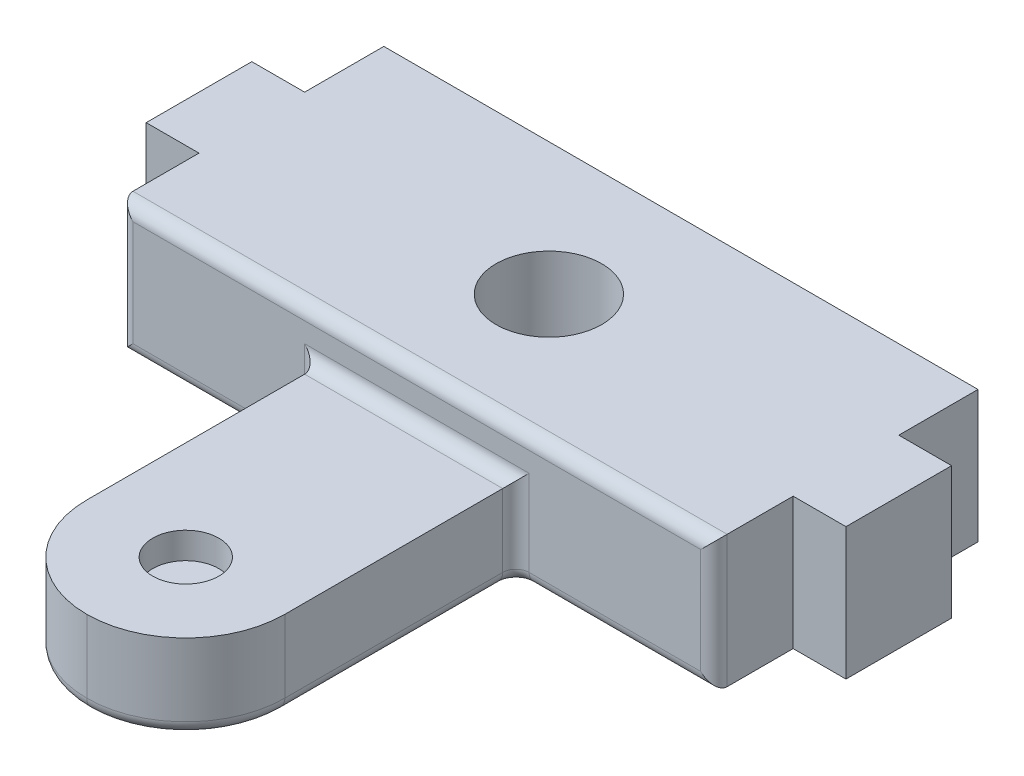
ISO-10303-21;
HEADER;
FILE_DESCRIPTION(('STEP AP214'),'2;1');
FILE_NAME('part.step','',(''),(''),'','','');
FILE_SCHEMA(('AUTOMOTIVE_DESIGN { 1 0 10303 214 1 1 1 1 }'));
ENDSEC;
DATA;
#1=APPLICATION_CONTEXT('core data for automotive mechanical design processes');
#2=APPLICATION_PROTOCOL_DEFINITION('international standard','automotive_design',2000,#1);
#3=PRODUCT_CONTEXT('',#1,'mechanical');
#4=PRODUCT('Part','Part','',(#3));
#5=PRODUCT_RELATED_PRODUCT_CATEGORY('part','',(#4));
#6=PRODUCT_DEFINITION_FORMATION('','',#4);
#7=PRODUCT_DEFINITION_CONTEXT('part definition',#1,'design');
#8=PRODUCT_DEFINITION('design','',#6,#7);
#9=PRODUCT_DEFINITION_SHAPE('','',#8);
#10=(LENGTH_UNIT() NAMED_UNIT(*) SI_UNIT(.MILLI.,.METRE.));
#11=(NAMED_UNIT(*) PLANE_ANGLE_UNIT() SI_UNIT($,.RADIAN.));
#12=(NAMED_UNIT(*) SI_UNIT($,.STERADIAN.) SOLID_ANGLE_UNIT());
#13=UNCERTAINTY_MEASURE_WITH_UNIT(LENGTH_MEASURE(1.E-05),#10,'distance_accuracy_value','');
#14=(GEOMETRIC_REPRESENTATION_CONTEXT(3) GLOBAL_UNCERTAINTY_ASSIGNED_CONTEXT((#13)) GLOBAL_UNIT_ASSIGNED_CONTEXT((#10,
#11,#12)) REPRESENTATION_CONTEXT('',''));
#15=CARTESIAN_POINT('',(0.,0.,0.));
#16=DIRECTION('',(0.,0.,1.));
#17=DIRECTION('',(1.,0.,0.));
#18=AXIS2_PLACEMENT_3D('',#15,#16,#17);
#19=CARTESIAN_POINT('',(-265.,-50.,-40.));
#20=DIRECTION('',(0.,0.,-1.));
#21=DIRECTION('',(-1.,0.,0.));
#22=AXIS2_PLACEMENT_3D('',#19,#20,#21);
#23=PLANE('',#22);
#24=DIRECTION('',(0.,1.,0.));
#25=VECTOR('',#24,1.);
#26=CARTESIAN_POINT('',(-265.,-50.,-40.));
#27=LINE('',#26,#25);
#28=CARTESIAN_POINT('',(-265.,-50.,-40.));
#29=VERTEX_POINT('',#28);
#30=CARTESIAN_POINT('',(-265.,50.,-40.));
#31=VERTEX_POINT('',#30);
#32=EDGE_CURVE('E415',#29,#31,#27,.T.);
#33=ORIENTED_EDGE('',*,*,#32,.T.);
#34=DIRECTION('',(-1.,0.,0.));
#35=VECTOR('',#34,1.);
#36=CARTESIAN_POINT('',(-265.,50.,-40.));
#37=LINE('',#36,#35);
#38=CARTESIAN_POINT('',(-225.,50.,-40.));
#39=VERTEX_POINT('',#38);
#40=EDGE_CURVE('E353',#39,#31,#37,.T.);
#41=ORIENTED_EDGE('',*,*,#40,.F.);
#42=DIRECTION('',(0.,1.,0.));
#43=VECTOR('',#42,1.);
#44=CARTESIAN_POINT('',(-225.,-50.,-40.));
#45=LINE('',#44,#43);
#46=CARTESIAN_POINT('',(-225.,-50.,-40.));
#47=VERTEX_POINT('',#46);
#48=EDGE_CURVE('E238',#47,#39,#45,.T.);
#49=ORIENTED_EDGE('',*,*,#48,.F.);
#50=DIRECTION('',(-1.,0.,0.));
#51=VECTOR('',#50,1.);
#52=CARTESIAN_POINT('',(-265.,-50.,-40.));
#53=LINE('',#52,#51);
#54=EDGE_CURVE('E384',#47,#29,#53,.T.);
#55=ORIENTED_EDGE('',*,*,#54,.T.);
#56=EDGE_LOOP('',(#33,#41,#49,#55));
#57=FACE_BOUND('',#56,.T.);
#58=ADVANCED_FACE('F41',(#57),#23,.T.);
#59=CARTESIAN_POINT('',(-225.,-50.,-40.));
#60=DIRECTION('',(-1.,0.,0.));
#61=DIRECTION('',(0.,0.,1.));
#62=AXIS2_PLACEMENT_3D('',#59,#60,#61);
#63=PLANE('',#62);
#64=ORIENTED_EDGE('',*,*,#48,.T.);
#65=DIRECTION('',(0.,0.,1.));
#66=VECTOR('',#65,1.);
#67=CARTESIAN_POINT('',(-225.,50.,-40.));
#68=LINE('',#67,#66);
#69=CARTESIAN_POINT('',(-225.,50.,-100.));
#70=VERTEX_POINT('',#69);
#71=EDGE_CURVE('E381',#70,#39,#68,.T.);
#72=ORIENTED_EDGE('',*,*,#71,.F.);
#73=DIRECTION('',(0.,1.,0.));
#74=VECTOR('',#73,1.);
#75=CARTESIAN_POINT('',(-225.,-50.,-100.));
#76=LINE('',#75,#74);
#77=CARTESIAN_POINT('',(-225.,-50.,-100.));
#78=VERTEX_POINT('',#77);
#79=EDGE_CURVE('E417',#78,#70,#76,.T.);
#80=ORIENTED_EDGE('',*,*,#79,.F.);
#81=DIRECTION('',(0.,0.,1.));
#82=VECTOR('',#81,1.);
#83=CARTESIAN_POINT('',(-225.,-50.,-40.));
#84=LINE('',#83,#82);
#85=EDGE_CURVE('E412',#78,#47,#84,.T.);
#86=ORIENTED_EDGE('',*,*,#85,.T.);
#87=EDGE_LOOP('',(#64,#72,#80,#86));
#88=FACE_BOUND('',#87,.T.);
#89=ADVANCED_FACE('F446',(#88),#63,.T.);
#90=CARTESIAN_POINT('',(-225.,-50.,-100.));
#91=DIRECTION('',(0.,0.,-1.));
#92=DIRECTION('',(-1.,0.,0.));
#93=AXIS2_PLACEMENT_3D('',#90,#91,#92);
#94=PLANE('',#93);
#95=ORIENTED_EDGE('',*,*,#79,.T.);
#96=DIRECTION('',(-1.,0.,0.));
#97=VECTOR('',#96,1.);
#98=CARTESIAN_POINT('',(-225.,50.,-100.));
#99=LINE('',#98,#97);
#100=CARTESIAN_POINT('',(225.,50.,-100.));
#101=VERTEX_POINT('',#100);
#102=EDGE_CURVE('E378',#101,#70,#99,.T.);
#103=ORIENTED_EDGE('',*,*,#102,.F.);
#104=DIRECTION('',(0.,1.,0.));
#105=VECTOR('',#104,1.);
#106=CARTESIAN_POINT('',(225.,-50.,-100.));
#107=LINE('',#106,#105);
#108=CARTESIAN_POINT('',(225.,-50.,-100.));
#109=VERTEX_POINT('',#108);
#110=EDGE_CURVE('E419',#109,#101,#107,.T.);
#111=ORIENTED_EDGE('',*,*,#110,.F.);
#112=DIRECTION('',(-1.,0.,0.));
#113=VECTOR('',#112,1.);
#114=CARTESIAN_POINT('',(-225.,-50.,-100.));
#115=LINE('',#114,#113);
#116=EDGE_CURVE('E409',#109,#78,#115,.T.);
#117=ORIENTED_EDGE('',*,*,#116,.T.);
#118=EDGE_LOOP('',(#95,#103,#111,#117));
#119=FACE_BOUND('',#118,.T.);
#120=ADVANCED_FACE('F511',(#119),#94,.T.);
#121=CARTESIAN_POINT('',(225.,-50.,-40.));
#122=DIRECTION('',(1.,0.,0.));
#123=DIRECTION('',(0.,0.,-1.));
#124=AXIS2_PLACEMENT_3D('',#121,#122,#123);
#125=PLANE('',#124);
#126=ORIENTED_EDGE('',*,*,#110,.T.);
#127=DIRECTION('',(0.,0.,-1.));
#128=VECTOR('',#127,1.);
#129=CARTESIAN_POINT('',(225.,50.,-40.));
#130=LINE('',#129,#128);
#131=CARTESIAN_POINT('',(225.,50.,-40.));
#132=VERTEX_POINT('',#131);
#133=EDGE_CURVE('E375',#132,#101,#130,.T.);
#134=ORIENTED_EDGE('',*,*,#133,.F.);
#135=DIRECTION('',(0.,1.,0.));
#136=VECTOR('',#135,1.);
#137=CARTESIAN_POINT('',(225.,-50.,-40.));
#138=LINE('',#137,#136);
#139=CARTESIAN_POINT('',(225.,-50.,-40.));
#140=VERTEX_POINT('',#139);
#141=EDGE_CURVE('E421',#140,#132,#138,.T.);
#142=ORIENTED_EDGE('',*,*,#141,.F.);
#143=DIRECTION('',(0.,0.,-1.));
#144=VECTOR('',#143,1.);
#145=CARTESIAN_POINT('',(225.,-50.,-40.));
#146=LINE('',#145,#144);
#147=EDGE_CURVE('E406',#140,#109,#146,.T.);
#148=ORIENTED_EDGE('',*,*,#147,.T.);
#149=EDGE_LOOP('',(#126,#134,#142,#148));
#150=FACE_BOUND('',#149,.T.);
#151=ADVANCED_FACE('F771',(#150),#125,.T.);
#152=CARTESIAN_POINT('',(265.,-50.,-40.));
#153=DIRECTION('',(0.,0.,-1.));
#154=DIRECTION('',(-1.,0.,0.));
#155=AXIS2_PLACEMENT_3D('',#152,#153,#154);
#156=PLANE('',#155);
#157=ORIENTED_EDGE('',*,*,#141,.T.);
#158=DIRECTION('',(-1.,0.,0.));
#159=VECTOR('',#158,1.);
#160=CARTESIAN_POINT('',(265.,50.,-40.));
#161=LINE('',#160,#159);
#162=CARTESIAN_POINT('',(265.,50.,-40.));
#163=VERTEX_POINT('',#162);
#164=EDGE_CURVE('E372',#163,#132,#161,.T.);
#165=ORIENTED_EDGE('',*,*,#164,.F.);
#166=DIRECTION('',(0.,1.,0.));
#167=VECTOR('',#166,1.);
#168=CARTESIAN_POINT('',(265.,-50.,-40.));
#169=LINE('',#168,#167);
#170=CARTESIAN_POINT('',(265.,-50.,-40.));
#171=VERTEX_POINT('',#170);
#172=EDGE_CURVE('E423',#171,#163,#169,.T.);
#173=ORIENTED_EDGE('',*,*,#172,.F.);
#174=DIRECTION('',(-1.,0.,0.));
#175=VECTOR('',#174,1.);
#176=CARTESIAN_POINT('',(265.,-50.,-40.));
#177=LINE('',#176,#175);
#178=EDGE_CURVE('E403',#171,#140,#177,.T.);
#179=ORIENTED_EDGE('',*,*,#178,.T.);
#180=EDGE_LOOP('',(#157,#165,#173,#179));
#181=FACE_BOUND('',#180,.T.);
#182=ADVANCED_FACE('F762',(#181),#156,.T.);
#183=CARTESIAN_POINT('',(265.,-50.,39.9999999999999));
#184=DIRECTION('',(1.,0.,0.));
#185=DIRECTION('',(0.,0.,-1.));
#186=AXIS2_PLACEMENT_3D('',#183,#184,#185);
#187=PLANE('',#186);
#188=ORIENTED_EDGE('',*,*,#172,.T.);
#189=DIRECTION('',(0.,0.,-1.));
#190=VECTOR('',#189,1.);
#191=CARTESIAN_POINT('',(265.,50.,39.9999999999999));
#192=LINE('',#191,#190);
#193=CARTESIAN_POINT('',(265.,50.,39.9999999999999));
#194=VERTEX_POINT('',#193);
#195=EDGE_CURVE('E369',#194,#163,#192,.T.);
#196=ORIENTED_EDGE('',*,*,#195,.F.);
#197=DIRECTION('',(0.,1.,0.));
#198=VECTOR('',#197,1.);
#199=CARTESIAN_POINT('',(265.,-50.,39.9999999999999));
#200=LINE('',#199,#198);
#201=CARTESIAN_POINT('',(265.,-50.,39.9999999999999));
#202=VERTEX_POINT('',#201);
#203=EDGE_CURVE('E425',#202,#194,#200,.T.);
#204=ORIENTED_EDGE('',*,*,#203,.F.);
#205=DIRECTION('',(0.,0.,-1.));
#206=VECTOR('',#205,1.);
#207=CARTESIAN_POINT('',(265.,-50.,39.9999999999999));
#208=LINE('',#207,#206);
#209=EDGE_CURVE('E400',#202,#171,#208,.T.);
#210=ORIENTED_EDGE('',*,*,#209,.T.);
#211=EDGE_LOOP('',(#188,#196,#204,#210));
#212=FACE_BOUND('',#211,.T.);
#213=ADVANCED_FACE('F753',(#212),#187,.T.);
#214=CARTESIAN_POINT('',(265.,-50.,39.9999999999999));
#215=DIRECTION('',(0.,0.,1.));
#216=DIRECTION('',(1.,0.,0.));
#217=AXIS2_PLACEMENT_3D('',#214,#215,#216);
#218=PLANE('',#217);
#219=ORIENTED_EDGE('',*,*,#203,.T.);
#220=DIRECTION('',(1.,0.,0.));
#221=VECTOR('',#220,1.);
#222=CARTESIAN_POINT('',(265.,50.,39.9999999999999));
#223=LINE('',#222,#221);
#224=CARTESIAN_POINT('',(225.,50.,39.9999999999999));
#225=VERTEX_POINT('',#224);
#226=EDGE_CURVE('E366',#225,#194,#223,.T.);
#227=ORIENTED_EDGE('',*,*,#226,.F.);
#228=DIRECTION('',(0.,1.,0.));
#229=VECTOR('',#228,1.);
#230=CARTESIAN_POINT('',(225.,-50.,39.9999999999999));
#231=LINE('',#230,#229);
#232=CARTESIAN_POINT('',(225.,-50.,39.9999999999999));
#233=VERTEX_POINT('',#232);
#234=EDGE_CURVE('E427',#233,#225,#231,.T.);
#235=ORIENTED_EDGE('',*,*,#234,.F.);
#236=DIRECTION('',(1.,0.,0.));
#237=VECTOR('',#236,1.);
#238=CARTESIAN_POINT('',(265.,-50.,39.9999999999999));
#239=LINE('',#238,#237);
#240=EDGE_CURVE('E397',#233,#202,#239,.T.);
#241=ORIENTED_EDGE('',*,*,#240,.T.);
#242=EDGE_LOOP('',(#219,#227,#235,#241));
#243=FACE_BOUND('',#242,.T.);
#244=ADVANCED_FACE('F745',(#243),#218,.T.);
#245=CARTESIAN_POINT('',(225.,-50.,39.9999999999999));
#246=DIRECTION('',(1.,0.,0.));
#247=DIRECTION('',(0.,0.,-1.));
#248=AXIS2_PLACEMENT_3D('',#245,#246,#247);
#249=PLANE('',#248);
#250=DIRECTION('',(0.,0.,-1.));
#251=VECTOR('',#250,1.);
#252=CARTESIAN_POINT('',(225.,50.,39.9999999999999));
#253=LINE('',#252,#251);
#254=CARTESIAN_POINT('',(225.,50.,89.9999999999999));
#255=VERTEX_POINT('',#254);
#256=EDGE_CURVE('E364',#255,#225,#253,.T.);
#257=ORIENTED_EDGE('',*,*,#256,.F.);
#258=DIRECTION('',(0.,1.,0.));
#259=VECTOR('',#258,1.);
#260=CARTESIAN_POINT('',(225.,-50.,89.9999999999999));
#261=LINE('',#260,#259);
#262=CARTESIAN_POINT('',(225.,-50.,89.9999999999999));
#263=VERTEX_POINT('',#262);
#264=EDGE_CURVE('E11',#255,#263,#261,.F.);
#265=ORIENTED_EDGE('',*,*,#264,.T.);
#266=DIRECTION('',(0.,0.,-1.));
#267=VECTOR('',#266,1.);
#268=CARTESIAN_POINT('',(225.,-50.,39.9999999999999));
#269=LINE('',#268,#267);
#270=EDGE_CURVE('E395',#263,#233,#269,.T.);
#271=ORIENTED_EDGE('',*,*,#270,.T.);
#272=ORIENTED_EDGE('',*,*,#234,.T.);
#273=EDGE_LOOP('',(#257,#265,#271,#272));
#274=FACE_BOUND('',#273,.T.);
#275=ADVANCED_FACE('F737',(#274),#249,.T.);
#276=CARTESIAN_POINT('',(-225.,-50.,100.));
#277=DIRECTION('',(0.,0.,1.));
#278=DIRECTION('',(1.,0.,0.));
#279=AXIS2_PLACEMENT_3D('',#276,#277,#278);
#280=PLANE('',#279);
#281=DIRECTION('',(0.,-1.,0.));
#282=VECTOR('',#281,1.);
#283=CARTESIAN_POINT('',(-85.,-50.,100.));
#284=LINE('',#283,#282);
#285=CARTESIAN_POINT('',(-85.,-40.,100.));
#286=VERTEX_POINT('',#285);
#287=CARTESIAN_POINT('',(-85.,25.,100.));
#288=VERTEX_POINT('',#287);
#289=EDGE_CURVE('E287',#286,#288,#284,.F.);
#290=ORIENTED_EDGE('',*,*,#289,.T.);
#291=DIRECTION('',(-1.,0.,0.));
#292=VECTOR('',#291,1.);
#293=CARTESIAN_POINT('',(-225.,25.,100.));
#294=LINE('',#293,#292);
#295=CARTESIAN_POINT('',(85.,25.,99.9999999999999));
#296=VERTEX_POINT('',#295);
#297=EDGE_CURVE('E289',#288,#296,#294,.F.);
#298=ORIENTED_EDGE('',*,*,#297,.T.);
#299=DIRECTION('',(0.,1.,0.));
#300=VECTOR('',#299,1.);
#301=CARTESIAN_POINT('',(85.,-50.,99.9999999999999));
#302=LINE('',#301,#300);
#303=CARTESIAN_POINT('',(85.,-40.,99.9999999999999));
#304=VERTEX_POINT('',#303);
#305=EDGE_CURVE('E275',#296,#304,#302,.F.);
#306=ORIENTED_EDGE('',*,*,#305,.T.);
#307=DIRECTION('',(1.,0.,0.));
#308=VECTOR('',#307,1.);
#309=CARTESIAN_POINT('',(225.,-40.,99.9999999999999));
#310=LINE('',#309,#308);
#311=CARTESIAN_POINT('',(215.,-40.,99.9999999999999));
#312=VERTEX_POINT('',#311);
#313=EDGE_CURVE('E277',#304,#312,#310,.T.);
#314=ORIENTED_EDGE('',*,*,#313,.T.);
#315=DIRECTION('',(0.,1.,0.));
#316=VECTOR('',#315,1.);
#317=CARTESIAN_POINT('',(215.,-50.,99.9999999999999));
#318=LINE('',#317,#316);
#319=CARTESIAN_POINT('',(215.,40.,99.9999999999999));
#320=VERTEX_POINT('',#319);
#321=EDGE_CURVE('E279',#312,#320,#318,.T.);
#322=ORIENTED_EDGE('',*,*,#321,.T.);
#323=DIRECTION('',(1.,0.,0.));
#324=VECTOR('',#323,1.);
#325=CARTESIAN_POINT('',(-225.,40.,100.));
#326=LINE('',#325,#324);
#327=CARTESIAN_POINT('',(-215.,40.,100.));
#328=VERTEX_POINT('',#327);
#329=EDGE_CURVE('E281',#320,#328,#326,.F.);
#330=ORIENTED_EDGE('',*,*,#329,.T.);
#331=DIRECTION('',(0.,1.,0.));
#332=VECTOR('',#331,1.);
#333=CARTESIAN_POINT('',(-215.,-50.,100.));
#334=LINE('',#333,#332);
#335=CARTESIAN_POINT('',(-215.,-40.,100.));
#336=VERTEX_POINT('',#335);
#337=EDGE_CURVE('E283',#328,#336,#334,.F.);
#338=ORIENTED_EDGE('',*,*,#337,.T.);
#339=DIRECTION('',(1.,0.,0.));
#340=VECTOR('',#339,1.);
#341=CARTESIAN_POINT('',(-75.,-40.,99.9999999999999));
#342=LINE('',#341,#340);
#343=EDGE_CURVE('E285',#336,#286,#342,.T.);
#344=ORIENTED_EDGE('',*,*,#343,.T.);
#345=EDGE_LOOP('',(#290,#298,#306,#314,#322,#330,#338,#344));
#346=FACE_BOUND('',#345,.T.);
#347=ADVANCED_FACE('F468',(#346),#280,.T.);
#348=CARTESIAN_POINT('',(-225.,-50.,40.));
#349=DIRECTION('',(-1.,0.,0.));
#350=DIRECTION('',(0.,0.,1.));
#351=AXIS2_PLACEMENT_3D('',#348,#349,#350);
#352=PLANE('',#351);
#353=DIRECTION('',(0.,0.,1.));
#354=VECTOR('',#353,1.);
#355=CARTESIAN_POINT('',(-225.,-50.,40.));
#356=LINE('',#355,#354);
#357=CARTESIAN_POINT('',(-225.,-50.,40.));
#358=VERTEX_POINT('',#357);
#359=CARTESIAN_POINT('',(-225.,-50.,90.));
#360=VERTEX_POINT('',#359);
#361=EDGE_CURVE('E393',#358,#360,#356,.T.);
#362=ORIENTED_EDGE('',*,*,#361,.T.);
#363=DIRECTION('',(0.,1.,0.));
#364=VECTOR('',#363,1.);
#365=CARTESIAN_POINT('',(-225.,-50.,90.));
#366=LINE('',#365,#364);
#367=CARTESIAN_POINT('',(-225.,50.,90.));
#368=VERTEX_POINT('',#367);
#369=EDGE_CURVE('E65',#360,#368,#366,.T.);
#370=ORIENTED_EDGE('',*,*,#369,.T.);
#371=DIRECTION('',(0.,0.,1.));
#372=VECTOR('',#371,1.);
#373=CARTESIAN_POINT('',(-225.,50.,40.));
#374=LINE('',#373,#372);
#375=CARTESIAN_POINT('',(-225.,50.,40.));
#376=VERTEX_POINT('',#375);
#377=EDGE_CURVE('E362',#376,#368,#374,.T.);
#378=ORIENTED_EDGE('',*,*,#377,.F.);
#379=DIRECTION('',(0.,1.,0.));
#380=VECTOR('',#379,1.);
#381=CARTESIAN_POINT('',(-225.,-50.,40.));
#382=LINE('',#381,#380);
#383=EDGE_CURVE('E430',#358,#376,#382,.T.);
#384=ORIENTED_EDGE('',*,*,#383,.F.);
#385=EDGE_LOOP('',(#362,#370,#378,#384));
#386=FACE_BOUND('',#385,.T.);
#387=ADVANCED_FACE('F455',(#386),#352,.T.);
#388=CARTESIAN_POINT('',(-265.,-50.,40.));
#389=DIRECTION('',(0.,0.,1.));
#390=DIRECTION('',(1.,0.,0.));
#391=AXIS2_PLACEMENT_3D('',#388,#389,#390);
#392=PLANE('',#391);
#393=ORIENTED_EDGE('',*,*,#383,.T.);
#394=DIRECTION('',(1.,0.,0.));
#395=VECTOR('',#394,1.);
#396=CARTESIAN_POINT('',(-265.,50.,40.));
#397=LINE('',#396,#395);
#398=CARTESIAN_POINT('',(-265.,50.,40.));
#399=VERTEX_POINT('',#398);
#400=EDGE_CURVE('E359',#399,#376,#397,.T.);
#401=ORIENTED_EDGE('',*,*,#400,.F.);
#402=DIRECTION('',(0.,1.,0.));
#403=VECTOR('',#402,1.);
#404=CARTESIAN_POINT('',(-265.,-50.,40.));
#405=LINE('',#404,#403);
#406=CARTESIAN_POINT('',(-265.,-50.,40.));
#407=VERTEX_POINT('',#406);
#408=EDGE_CURVE('E432',#407,#399,#405,.T.);
#409=ORIENTED_EDGE('',*,*,#408,.F.);
#410=DIRECTION('',(1.,0.,0.));
#411=VECTOR('',#410,1.);
#412=CARTESIAN_POINT('',(-265.,-50.,40.));
#413=LINE('',#412,#411);
#414=EDGE_CURVE('E390',#407,#358,#413,.T.);
#415=ORIENTED_EDGE('',*,*,#414,.T.);
#416=EDGE_LOOP('',(#393,#401,#409,#415));
#417=FACE_BOUND('',#416,.T.);
#418=ADVANCED_FACE('F454',(#417),#392,.T.);
#419=CARTESIAN_POINT('',(-265.,-50.,40.));
#420=DIRECTION('',(-1.,0.,0.));
#421=DIRECTION('',(0.,0.,1.));
#422=AXIS2_PLACEMENT_3D('',#419,#420,#421);
#423=PLANE('',#422);
#424=ORIENTED_EDGE('',*,*,#408,.T.);
#425=DIRECTION('',(0.,0.,1.));
#426=VECTOR('',#425,1.);
#427=CARTESIAN_POINT('',(-265.,50.,40.));
#428=LINE('',#427,#426);
#429=EDGE_CURVE('E356',#31,#399,#428,.T.);
#430=ORIENTED_EDGE('',*,*,#429,.F.);
#431=ORIENTED_EDGE('',*,*,#32,.F.);
#432=DIRECTION('',(0.,0.,1.));
#433=VECTOR('',#432,1.);
#434=CARTESIAN_POINT('',(-265.,-50.,40.));
#435=LINE('',#434,#433);
#436=EDGE_CURVE('E387',#29,#407,#435,.T.);
#437=ORIENTED_EDGE('',*,*,#436,.T.);
#438=EDGE_LOOP('',(#424,#430,#431,#437));
#439=FACE_BOUND('',#438,.T.);
#440=ADVANCED_FACE('F439',(#439),#423,.T.);
#441=CARTESIAN_POINT('',(0.,-50.,0.));
#442=DIRECTION('',(0.,1.,0.));
#443=DIRECTION('',(0.,0.,1.));
#444=AXIS2_PLACEMENT_3D('',#441,#442,#443);
#445=PLANE('',#444);
#446=CARTESIAN_POINT('',(0.,-50.,0.));
#447=DIRECTION('',(0.,1.,0.));
#448=DIRECTION('',(0.,0.,1.));
#449=AXIS2_PLACEMENT_3D('',#446,#447,#448);
#450=CIRCLE('',#449,40.);
#451=CARTESIAN_POINT('',(0.,-50.,40.));
#452=VERTEX_POINT('',#451);
#453=EDGE_CURVE('E350',#452,#452,#450,.F.);
#454=ORIENTED_EDGE('',*,*,#453,.F.);
#455=EDGE_LOOP('',(#454));
#456=FACE_BOUND('',#455,.T.);
#457=CARTESIAN_POINT('',(-85.,-50.,110.));
#458=DIRECTION('',(0.,1.,0.));
#459=DIRECTION('',(0.,0.,1.));
#460=AXIS2_PLACEMENT_3D('',#457,#458,#459);
#461=CIRCLE('',#460,20.);
#462=CARTESIAN_POINT('',(-85.,-50.,90.));
#463=VERTEX_POINT('',#462);
#464=CARTESIAN_POINT('',(-65.,-50.,110.));
#465=VERTEX_POINT('',#464);
#466=EDGE_CURVE('E257',#463,#465,#461,.F.);
#467=ORIENTED_EDGE('',*,*,#466,.F.);
#468=DIRECTION('',(1.,0.,0.));
#469=VECTOR('',#468,1.);
#470=CARTESIAN_POINT('',(-225.,-50.,90.));
#471=LINE('',#470,#469);
#472=EDGE_CURVE('E260',#463,#360,#471,.F.);
#473=ORIENTED_EDGE('',*,*,#472,.T.);
#474=ORIENTED_EDGE('',*,*,#361,.F.);
#475=ORIENTED_EDGE('',*,*,#414,.F.);
#476=ORIENTED_EDGE('',*,*,#436,.F.);
#477=ORIENTED_EDGE('',*,*,#54,.F.);
#478=ORIENTED_EDGE('',*,*,#85,.F.);
#479=ORIENTED_EDGE('',*,*,#116,.F.);
#480=ORIENTED_EDGE('',*,*,#147,.F.);
#481=ORIENTED_EDGE('',*,*,#178,.F.);
#482=ORIENTED_EDGE('',*,*,#209,.F.);
#483=ORIENTED_EDGE('',*,*,#240,.F.);
#484=ORIENTED_EDGE('',*,*,#270,.F.);
#485=DIRECTION('',(1.,0.,0.));
#486=VECTOR('',#485,1.);
#487=CARTESIAN_POINT('',(75.,-50.,89.9999999999999));
#488=LINE('',#487,#486);
#489=CARTESIAN_POINT('',(85.,-50.,89.9999999999999));
#490=VERTEX_POINT('',#489);
#491=EDGE_CURVE('E246',#263,#490,#488,.F.);
#492=ORIENTED_EDGE('',*,*,#491,.T.);
#493=CARTESIAN_POINT('',(85.,-50.,110.));
#494=DIRECTION('',(0.,1.,0.));
#495=DIRECTION('',(0.,0.,1.));
#496=AXIS2_PLACEMENT_3D('',#493,#494,#495);
#497=CIRCLE('',#496,20.);
#498=CARTESIAN_POINT('',(65.,-50.,110.));
#499=VERTEX_POINT('',#498);
#500=EDGE_CURVE('E235',#499,#490,#497,.F.);
#501=ORIENTED_EDGE('',*,*,#500,.F.);
#502=DIRECTION('',(0.,0.,-1.));
#503=VECTOR('',#502,1.);
#504=CARTESIAN_POINT('',(65.,-50.,0.));
#505=LINE('',#504,#503);
#506=CARTESIAN_POINT('',(65.,-50.,275.));
#507=VERTEX_POINT('',#506);
#508=EDGE_CURVE('E248',#499,#507,#505,.F.);
#509=ORIENTED_EDGE('',*,*,#508,.T.);
#510=CARTESIAN_POINT('',(0.,-50.,275.));
#511=DIRECTION('',(0.,1.,0.));
#512=DIRECTION('',(0.,0.,1.));
#513=AXIS2_PLACEMENT_3D('',#510,#511,#512);
#514=CIRCLE('',#513,65.);
#515=CARTESIAN_POINT('',(0.,-50.,340.));
#516=VERTEX_POINT('',#515);
#517=EDGE_CURVE('E250',#507,#516,#514,.F.);
#518=ORIENTED_EDGE('',*,*,#517,.T.);
#519=CARTESIAN_POINT('',(0.,-50.,275.));
#520=DIRECTION('',(0.,1.,0.));
#521=DIRECTION('',(0.,0.,1.));
#522=AXIS2_PLACEMENT_3D('',#519,#520,#521);
#523=CIRCLE('',#522,65.);
#524=CARTESIAN_POINT('',(-65.,-50.,275.));
#525=VERTEX_POINT('',#524);
#526=EDGE_CURVE('E252',#516,#525,#523,.F.);
#527=ORIENTED_EDGE('',*,*,#526,.T.);
#528=DIRECTION('',(0.,0.,-1.));
#529=VECTOR('',#528,1.);
#530=CARTESIAN_POINT('',(-65.,-50.,0.));
#531=LINE('',#530,#529);
#532=EDGE_CURVE('E255',#525,#465,#531,.T.);
#533=ORIENTED_EDGE('',*,*,#532,.T.);
#534=EDGE_LOOP('',(#467,#473,#474,#475,#476,#477,#478,#479,#480,#481,#482,#483,#484,#492,#501,
#509,#518,#527,#533));
#535=FACE_BOUND('',#534,.T.);
#536=ADVANCED_FACE('F449',(#456,#535),#445,.F.);
#537=CARTESIAN_POINT('',(0.,50.,0.));
#538=DIRECTION('',(0.,1.,0.));
#539=DIRECTION('',(0.,0.,1.));
#540=AXIS2_PLACEMENT_3D('',#537,#538,#539);
#541=PLANE('',#540);
#542=ORIENTED_EDGE('',*,*,#377,.T.);
#543=DIRECTION('',(1.,0.,0.));
#544=VECTOR('',#543,1.);
#545=CARTESIAN_POINT('',(0.,50.,89.9999999999999));
#546=LINE('',#545,#544);
#547=EDGE_CURVE('E50',#368,#255,#546,.T.);
#548=ORIENTED_EDGE('',*,*,#547,.T.);
#549=ORIENTED_EDGE('',*,*,#256,.T.);
#550=ORIENTED_EDGE('',*,*,#226,.T.);
#551=ORIENTED_EDGE('',*,*,#195,.T.);
#552=ORIENTED_EDGE('',*,*,#164,.T.);
#553=ORIENTED_EDGE('',*,*,#133,.T.);
#554=ORIENTED_EDGE('',*,*,#102,.T.);
#555=ORIENTED_EDGE('',*,*,#71,.T.);
#556=ORIENTED_EDGE('',*,*,#40,.T.);
#557=ORIENTED_EDGE('',*,*,#429,.T.);
#558=ORIENTED_EDGE('',*,*,#400,.T.);
#559=EDGE_LOOP('',(#542,#548,#549,#550,#551,#552,#553,#554,#555,#556,#557,#558));
#560=FACE_BOUND('',#559,.T.);
#561=CARTESIAN_POINT('',(0.,50.,0.));
#562=DIRECTION('',(0.,1.,0.));
#563=DIRECTION('',(0.,0.,1.));
#564=AXIS2_PLACEMENT_3D('',#561,#562,#563);
#565=CIRCLE('',#564,40.);
#566=CARTESIAN_POINT('',(0.,50.,40.));
#567=VERTEX_POINT('',#566);
#568=EDGE_CURVE('E242',#567,#567,#565,.T.);
#569=ORIENTED_EDGE('',*,*,#568,.F.);
#570=EDGE_LOOP('',(#569));
#571=FACE_BOUND('',#570,.T.);
#572=ADVANCED_FACE('F441',(#560,#571),#541,.T.);
#573=CARTESIAN_POINT('',(0.,-163.137084989848,0.));
#574=DIRECTION('',(0.,1.,0.));
#575=DIRECTION('',(0.,0.,1.));
#576=AXIS2_PLACEMENT_3D('',#573,#574,#575);
#577=CYLINDRICAL_SURFACE('',#576,40.);
#578=ORIENTED_EDGE('',*,*,#453,.T.);
#579=EDGE_LOOP('',(#578));
#580=FACE_BOUND('',#579,.T.);
#581=ORIENTED_EDGE('',*,*,#568,.T.);
#582=EDGE_LOOP('',(#581));
#583=FACE_BOUND('',#582,.T.);
#584=ADVANCED_FACE('F684',(#580,#583),#577,.F.);
#585=CARTESIAN_POINT('',(-75.,-50.,350.));
#586=DIRECTION('',(1.,0.,0.));
#587=DIRECTION('',(0.,1.,0.));
#588=AXIS2_PLACEMENT_3D('',#585,#586,#587);
#589=PLANE('',#588);
#590=DIRECTION('',(0.,-1.,0.));
#591=VECTOR('',#590,1.);
#592=CARTESIAN_POINT('',(-75.,-50.,110.));
#593=LINE('',#592,#591);
#594=CARTESIAN_POINT('',(-75.,15.,110.));
#595=VERTEX_POINT('',#594);
#596=CARTESIAN_POINT('',(-75.,-40.,110.));
#597=VERTEX_POINT('',#596);
#598=EDGE_CURVE('E266',#595,#597,#593,.T.);
#599=ORIENTED_EDGE('',*,*,#598,.T.);
#600=DIRECTION('',(0.,0.,-1.));
#601=VECTOR('',#600,1.);
#602=CARTESIAN_POINT('',(-75.,-40.,350.));
#603=LINE('',#602,#601);
#604=CARTESIAN_POINT('',(-75.,-40.,275.));
#605=VERTEX_POINT('',#604);
#606=EDGE_CURVE('E268',#597,#605,#603,.F.);
#607=ORIENTED_EDGE('',*,*,#606,.T.);
#608=DIRECTION('',(0.,-1.,0.));
#609=VECTOR('',#608,1.);
#610=CARTESIAN_POINT('',(-75.,-50.,275.));
#611=LINE('',#610,#609);
#612=CARTESIAN_POINT('',(-75.,15.,275.));
#613=VERTEX_POINT('',#612);
#614=EDGE_CURVE('E233',#605,#613,#611,.F.);
#615=ORIENTED_EDGE('',*,*,#614,.T.);
#616=DIRECTION('',(0.,0.,1.));
#617=VECTOR('',#616,1.);
#618=CARTESIAN_POINT('',(-75.,15.,350.));
#619=LINE('',#618,#617);
#620=EDGE_CURVE('E219',#595,#613,#619,.T.);
#621=ORIENTED_EDGE('',*,*,#620,.F.);
#622=EDGE_LOOP('',(#599,#607,#615,#621));
#623=FACE_BOUND('',#622,.T.);
#624=ADVANCED_FACE('F676',(#623),#589,.F.);
#625=CARTESIAN_POINT('',(75.,-50.,350.));
#626=DIRECTION('',(-1.,0.,0.));
#627=DIRECTION('',(0.,-1.,0.));
#628=AXIS2_PLACEMENT_3D('',#625,#626,#627);
#629=PLANE('',#628);
#630=DIRECTION('',(0.,1.,0.));
#631=VECTOR('',#630,1.);
#632=CARTESIAN_POINT('',(75.,-50.,275.));
#633=LINE('',#632,#631);
#634=CARTESIAN_POINT('',(75.,15.,275.));
#635=VERTEX_POINT('',#634);
#636=CARTESIAN_POINT('',(75.,-40.,275.));
#637=VERTEX_POINT('',#636);
#638=EDGE_CURVE('E224',#635,#637,#633,.F.);
#639=ORIENTED_EDGE('',*,*,#638,.T.);
#640=DIRECTION('',(0.,0.,-1.));
#641=VECTOR('',#640,1.);
#642=CARTESIAN_POINT('',(75.,-40.,350.));
#643=LINE('',#642,#641);
#644=CARTESIAN_POINT('',(75.,-40.,110.));
#645=VERTEX_POINT('',#644);
#646=EDGE_CURVE('E271',#637,#645,#643,.T.);
#647=ORIENTED_EDGE('',*,*,#646,.T.);
#648=DIRECTION('',(0.,1.,0.));
#649=VECTOR('',#648,1.);
#650=CARTESIAN_POINT('',(75.,-50.,110.));
#651=LINE('',#650,#649);
#652=CARTESIAN_POINT('',(75.,15.,110.));
#653=VERTEX_POINT('',#652);
#654=EDGE_CURVE('E227',#645,#653,#651,.T.);
#655=ORIENTED_EDGE('',*,*,#654,.T.);
#656=DIRECTION('',(0.,0.,-1.));
#657=VECTOR('',#656,1.);
#658=CARTESIAN_POINT('',(75.,15.,350.));
#659=LINE('',#658,#657);
#660=EDGE_CURVE('E211',#635,#653,#659,.T.);
#661=ORIENTED_EDGE('',*,*,#660,.F.);
#662=EDGE_LOOP('',(#639,#647,#655,#661));
#663=FACE_BOUND('',#662,.T.);
#664=ADVANCED_FACE('F223',(#663),#629,.F.);
#665=CARTESIAN_POINT('',(0.,0.,275.));
#666=DIRECTION('',(0.,1.,0.));
#667=DIRECTION('',(-1.,0.,0.));
#668=AXIS2_PLACEMENT_3D('',#665,#666,#667);
#669=CYLINDRICAL_SURFACE('',#668,75.);
#670=DIRECTION('',(0.,1.,0.));
#671=VECTOR('',#670,1.);
#672=CARTESIAN_POINT('',(0.,0.,350.));
#673=LINE('',#672,#671);
#674=CARTESIAN_POINT('',(0.,-40.,350.));
#675=VERTEX_POINT('',#674);
#676=CARTESIAN_POINT('',(0.,15.,350.));
#677=VERTEX_POINT('',#676);
#678=EDGE_CURVE('E218',#675,#677,#673,.T.);
#679=ORIENTED_EDGE('',*,*,#678,.F.);
#680=CARTESIAN_POINT('',(0.,-40.,275.));
#681=DIRECTION('',(0.,1.,0.));
#682=DIRECTION('',(0.,0.,1.));
#683=AXIS2_PLACEMENT_3D('',#680,#681,#682);
#684=CIRCLE('',#683,75.);
#685=EDGE_CURVE('E232',#675,#637,#684,.T.);
#686=ORIENTED_EDGE('',*,*,#685,.T.);
#687=ORIENTED_EDGE('',*,*,#638,.F.);
#688=CARTESIAN_POINT('',(0.,15.,275.));
#689=DIRECTION('',(0.,-1.,0.));
#690=DIRECTION('',(1.,0.,0.));
#691=AXIS2_PLACEMENT_3D('',#688,#689,#690);
#692=CIRCLE('',#691,75.);
#693=EDGE_CURVE('E208',#677,#635,#692,.F.);
#694=ORIENTED_EDGE('',*,*,#693,.F.);
#695=EDGE_LOOP('',(#679,#686,#687,#694));
#696=FACE_BOUND('',#695,.T.);
#697=ADVANCED_FACE('F230',(#696),#669,.T.);
#698=CARTESIAN_POINT('',(0.,0.,275.));
#699=DIRECTION('',(0.,-1.,0.));
#700=DIRECTION('',(1.,0.,0.));
#701=AXIS2_PLACEMENT_3D('',#698,#699,#700);
#702=CYLINDRICAL_SURFACE('',#701,75.);
#703=ORIENTED_EDGE('',*,*,#614,.F.);
#704=CARTESIAN_POINT('',(0.,-40.,275.));
#705=DIRECTION('',(0.,1.,0.));
#706=DIRECTION('',(0.,0.,1.));
#707=AXIS2_PLACEMENT_3D('',#704,#705,#706);
#708=CIRCLE('',#707,75.);
#709=EDGE_CURVE('E262',#605,#675,#708,.T.);
#710=ORIENTED_EDGE('',*,*,#709,.T.);
#711=ORIENTED_EDGE('',*,*,#678,.T.);
#712=CARTESIAN_POINT('',(0.,15.,275.));
#713=DIRECTION('',(0.,-1.,0.));
#714=DIRECTION('',(1.,0.,0.));
#715=AXIS2_PLACEMENT_3D('',#712,#713,#714);
#716=CIRCLE('',#715,75.);
#717=EDGE_CURVE('E214',#613,#677,#716,.F.);
#718=ORIENTED_EDGE('',*,*,#717,.F.);
#719=EDGE_LOOP('',(#703,#710,#711,#718));
#720=FACE_BOUND('',#719,.T.);
#721=ADVANCED_FACE('F516',(#720),#702,.T.);
#722=CARTESIAN_POINT('',(-200.,15.,350.));
#723=DIRECTION('',(0.,-1.,0.));
#724=DIRECTION('',(1.,0.,0.));
#725=AXIS2_PLACEMENT_3D('',#722,#723,#724);
#726=PLANE('',#725);
#727=CARTESIAN_POINT('',(0.,15.,275.));
#728=DIRECTION('',(0.,1.,0.));
#729=DIRECTION('',(-1.,0.,0.));
#730=AXIS2_PLACEMENT_3D('',#727,#728,#729);
#731=CIRCLE('',#730,25.);
#732=CARTESIAN_POINT('',(-25.,15.,275.));
#733=VERTEX_POINT('',#732);
#734=EDGE_CURVE('E336',#733,#733,#731,.T.);
#735=ORIENTED_EDGE('',*,*,#734,.F.);
#736=EDGE_LOOP('',(#735));
#737=FACE_BOUND('',#736,.T.);
#738=ORIENTED_EDGE('',*,*,#660,.T.);
#739=DIRECTION('',(-1.,0.,0.));
#740=VECTOR('',#739,1.);
#741=CARTESIAN_POINT('',(-200.,15.,110.));
#742=LINE('',#741,#740);
#743=EDGE_CURVE('E273',#653,#595,#742,.T.);
#744=ORIENTED_EDGE('',*,*,#743,.T.);
#745=ORIENTED_EDGE('',*,*,#620,.T.);
#746=ORIENTED_EDGE('',*,*,#717,.T.);
#747=ORIENTED_EDGE('',*,*,#693,.T.);
#748=EDGE_LOOP('',(#738,#744,#745,#746,#747));
#749=FACE_BOUND('',#748,.T.);
#750=ADVANCED_FACE('F210',(#737,#749),#726,.F.);
#751=CARTESIAN_POINT('',(0.,-5.,275.));
#752=DIRECTION('',(0.,1.,0.));
#753=DIRECTION('',(-1.,0.,0.));
#754=AXIS2_PLACEMENT_3D('',#751,#752,#753);
#755=CYLINDRICAL_SURFACE('',#754,25.);
#756=CARTESIAN_POINT('',(0.,-5.,275.));
#757=DIRECTION('',(0.,1.,0.));
#758=DIRECTION('',(-1.,0.,0.));
#759=AXIS2_PLACEMENT_3D('',#756,#757,#758);
#760=CIRCLE('',#759,25.);
#761=CARTESIAN_POINT('',(-25.,-5.,275.));
#762=VERTEX_POINT('',#761);
#763=EDGE_CURVE('E228',#762,#762,#760,.T.);
#764=ORIENTED_EDGE('',*,*,#763,.F.);
#765=EDGE_LOOP('',(#764));
#766=FACE_BOUND('',#765,.T.);
#767=ORIENTED_EDGE('',*,*,#734,.T.);
#768=EDGE_LOOP('',(#767));
#769=FACE_BOUND('',#768,.T.);
#770=ADVANCED_FACE('F640',(#766,#769),#755,.F.);
#771=CARTESIAN_POINT('',(0.,-5.,275.));
#772=DIRECTION('',(0.,1.,0.));
#773=DIRECTION('',(-1.,0.,0.));
#774=AXIS2_PLACEMENT_3D('',#771,#772,#773);
#775=PLANE('',#774);
#776=ORIENTED_EDGE('',*,*,#763,.T.);
#777=EDGE_LOOP('',(#776));
#778=FACE_BOUND('',#777,.T.);
#779=ADVANCED_FACE('F505',(#778),#775,.T.);
#780=CARTESIAN_POINT('',(215.,-50.,89.9999999999999));
#781=DIRECTION('',(0.,1.,0.));
#782=DIRECTION('',(0.,0.,1.));
#783=AXIS2_PLACEMENT_3D('',#780,#781,#782);
#784=CYLINDRICAL_SURFACE('',#783,10.);
#785=CARTESIAN_POINT('',(215.,-40.,89.9999999999999));
#786=DIRECTION('',(-0.707106781186547,-0.707106781186547,0.));
#787=DIRECTION('',(-0.707106781186547,0.707106781186547,0.));
#788=AXIS2_PLACEMENT_3D('',#785,#786,#787);
#789=ELLIPSE('',#788,14.1421356237309,10.);
#790=EDGE_CURVE('E329',#263,#312,#789,.T.);
#791=ORIENTED_EDGE('',*,*,#790,.F.);
#792=ORIENTED_EDGE('',*,*,#264,.F.);
#793=CARTESIAN_POINT('',(215.,40.,89.9999999999999));
#794=DIRECTION('',(-0.707106781186547,0.707106781186547,0.));
#795=DIRECTION('',(0.707106781186547,0.707106781186547,0.));
#796=AXIS2_PLACEMENT_3D('',#793,#794,#795);
#797=ELLIPSE('',#796,14.1421356237309,10.);
#798=EDGE_CURVE('E45',#320,#255,#797,.T.);
#799=ORIENTED_EDGE('',*,*,#798,.F.);
#800=ORIENTED_EDGE('',*,*,#321,.F.);
#801=EDGE_LOOP('',(#791,#792,#799,#800));
#802=FACE_BOUND('',#801,.T.);
#803=ADVANCED_FACE('F43',(#802),#784,.T.);
#804=CARTESIAN_POINT('',(0.,40.,89.9999999999999));
#805=DIRECTION('',(1.,0.,0.));
#806=DIRECTION('',(0.,0.,-1.));
#807=AXIS2_PLACEMENT_3D('',#804,#805,#806);
#808=CYLINDRICAL_SURFACE('',#807,10.);
#809=ORIENTED_EDGE('',*,*,#798,.T.);
#810=ORIENTED_EDGE('',*,*,#547,.F.);
#811=CARTESIAN_POINT('',(-215.,40.,90.));
#812=DIRECTION('',(0.707106781186547,0.707106781186547,0.));
#813=DIRECTION('',(0.707106781186547,-0.707106781186547,0.));
#814=AXIS2_PLACEMENT_3D('',#811,#812,#813);
#815=ELLIPSE('',#814,14.1421356237309,10.);
#816=EDGE_CURVE('E327',#328,#368,#815,.F.);
#817=ORIENTED_EDGE('',*,*,#816,.F.);
#818=ORIENTED_EDGE('',*,*,#329,.F.);
#819=EDGE_LOOP('',(#809,#810,#817,#818));
#820=FACE_BOUND('',#819,.T.);
#821=ADVANCED_FACE('F498',(#820),#808,.T.);
#822=CARTESIAN_POINT('',(85.,-50.,110.));
#823=DIRECTION('',(0.,1.,0.));
#824=DIRECTION('',(-1.,0.,0.));
#825=AXIS2_PLACEMENT_3D('',#822,#823,#824);
#826=CYLINDRICAL_SURFACE('',#825,10.);
#827=CARTESIAN_POINT('',(85.,-40.,110.));
#828=DIRECTION('',(0.,1.,0.));
#829=DIRECTION('',(0.,0.,1.));
#830=AXIS2_PLACEMENT_3D('',#827,#828,#829);
#831=CIRCLE('',#830,10.);
#832=EDGE_CURVE('E322',#304,#645,#831,.T.);
#833=ORIENTED_EDGE('',*,*,#832,.F.);
#834=ORIENTED_EDGE('',*,*,#305,.F.);
#835=CARTESIAN_POINT('',(85.,25.,110.));
#836=DIRECTION('',(-0.707106781186548,0.707106781186547,0.));
#837=DIRECTION('',(0.707106781186547,0.707106781186548,0.));
#838=AXIS2_PLACEMENT_3D('',#835,#836,#837);
#839=ELLIPSE('',#838,14.1421356237309,10.);
#840=EDGE_CURVE('E325',#653,#296,#839,.F.);
#841=ORIENTED_EDGE('',*,*,#840,.F.);
#842=ORIENTED_EDGE('',*,*,#654,.F.);
#843=EDGE_LOOP('',(#833,#834,#841,#842));
#844=FACE_BOUND('',#843,.T.);
#845=ADVANCED_FACE('F485',(#844),#826,.F.);
#846=CARTESIAN_POINT('',(-225.,-40.,90.));
#847=DIRECTION('',(-1.,0.,0.));
#848=DIRECTION('',(0.,0.,1.));
#849=AXIS2_PLACEMENT_3D('',#846,#847,#848);
#850=CYLINDRICAL_SURFACE('',#849,10.);
#851=ORIENTED_EDGE('',*,*,#790,.T.);
#852=ORIENTED_EDGE('',*,*,#313,.F.);
#853=CARTESIAN_POINT('',(85.,-40.,89.9999999999999));
#854=DIRECTION('',(-1.,0.,0.));
#855=DIRECTION('',(0.,0.,1.));
#856=AXIS2_PLACEMENT_3D('',#853,#854,#855);
#857=CIRCLE('',#856,10.);
#858=EDGE_CURVE('E319',#490,#304,#857,.T.);
#859=ORIENTED_EDGE('',*,*,#858,.F.);
#860=ORIENTED_EDGE('',*,*,#491,.F.);
#861=EDGE_LOOP('',(#851,#852,#859,#860));
#862=FACE_BOUND('',#861,.T.);
#863=ADVANCED_FACE('F484',(#862),#850,.T.);
#864=CARTESIAN_POINT('',(-215.,-50.,90.));
#865=DIRECTION('',(0.,1.,0.));
#866=DIRECTION('',(0.,0.,1.));
#867=AXIS2_PLACEMENT_3D('',#864,#865,#866);
#868=CYLINDRICAL_SURFACE('',#867,10.);
#869=ORIENTED_EDGE('',*,*,#816,.T.);
#870=ORIENTED_EDGE('',*,*,#369,.F.);
#871=CARTESIAN_POINT('',(-215.,-40.,90.));
#872=DIRECTION('',(-0.707106781186547,0.707106781186547,0.));
#873=DIRECTION('',(0.707106781186547,0.707106781186547,0.));
#874=AXIS2_PLACEMENT_3D('',#871,#872,#873);
#875=ELLIPSE('',#874,14.1421356237309,10.);
#876=EDGE_CURVE('E316',#336,#360,#875,.F.);
#877=ORIENTED_EDGE('',*,*,#876,.F.);
#878=ORIENTED_EDGE('',*,*,#337,.F.);
#879=EDGE_LOOP('',(#869,#870,#877,#878));
#880=FACE_BOUND('',#879,.T.);
#881=ADVANCED_FACE('F458',(#880),#868,.T.);
#882=CARTESIAN_POINT('',(-200.,25.,110.));
#883=DIRECTION('',(-1.,0.,0.));
#884=DIRECTION('',(0.,0.,1.));
#885=AXIS2_PLACEMENT_3D('',#882,#883,#884);
#886=CYLINDRICAL_SURFACE('',#885,10.);
#887=ORIENTED_EDGE('',*,*,#840,.T.);
#888=ORIENTED_EDGE('',*,*,#297,.F.);
#889=CARTESIAN_POINT('',(-85.,25.,110.));
#890=DIRECTION('',(-0.707106781186547,-0.707106781186547,0.));
#891=DIRECTION('',(0.707106781186547,-0.707106781186547,0.));
#892=AXIS2_PLACEMENT_3D('',#889,#890,#891);
#893=ELLIPSE('',#892,14.1421356237309,10.);
#894=EDGE_CURVE('E313',#595,#288,#893,.F.);
#895=ORIENTED_EDGE('',*,*,#894,.F.);
#896=ORIENTED_EDGE('',*,*,#743,.F.);
#897=EDGE_LOOP('',(#887,#888,#895,#896));
#898=FACE_BOUND('',#897,.T.);
#899=ADVANCED_FACE('F478',(#898),#886,.F.);
#900=CARTESIAN_POINT('',(85.,-40.,110.));
#901=DIRECTION('',(0.,1.,0.));
#902=DIRECTION('',(0.,0.,1.));
#903=AXIS2_PLACEMENT_3D('',#900,#901,#902);
#904=TOROIDAL_SURFACE('',#903,20.,10.);
#905=ORIENTED_EDGE('',*,*,#858,.T.);
#906=ORIENTED_EDGE('',*,*,#832,.T.);
#907=CARTESIAN_POINT('',(65.,-40.,110.));
#908=DIRECTION('',(0.,0.,-1.));
#909=DIRECTION('',(-1.,0.,0.));
#910=AXIS2_PLACEMENT_3D('',#907,#908,#909);
#911=CIRCLE('',#910,10.);
#912=EDGE_CURVE('E310',#499,#645,#911,.F.);
#913=ORIENTED_EDGE('',*,*,#912,.F.);
#914=ORIENTED_EDGE('',*,*,#500,.T.);
#915=EDGE_LOOP('',(#905,#906,#913,#914));
#916=FACE_BOUND('',#915,.T.);
#917=ADVANCED_FACE('F488',(#916),#904,.T.);
#918=CARTESIAN_POINT('',(-225.,-40.,90.));
#919=DIRECTION('',(-1.,0.,0.));
#920=DIRECTION('',(0.,0.,1.));
#921=AXIS2_PLACEMENT_3D('',#918,#919,#920);
#922=CYLINDRICAL_SURFACE('',#921,10.);
#923=ORIENTED_EDGE('',*,*,#876,.T.);
#924=ORIENTED_EDGE('',*,*,#472,.F.);
#925=CARTESIAN_POINT('',(-85.,-40.,90.));
#926=DIRECTION('',(1.,0.,0.));
#927=DIRECTION('',(0.,0.,-1.));
#928=AXIS2_PLACEMENT_3D('',#925,#926,#927);
#929=CIRCLE('',#928,10.);
#930=EDGE_CURVE('E307',#286,#463,#929,.T.);
#931=ORIENTED_EDGE('',*,*,#930,.F.);
#932=ORIENTED_EDGE('',*,*,#343,.F.);
#933=EDGE_LOOP('',(#923,#924,#931,#932));
#934=FACE_BOUND('',#933,.T.);
#935=ADVANCED_FACE('F464',(#934),#922,.T.);
#936=CARTESIAN_POINT('',(-85.,-50.,110.));
#937=DIRECTION('',(0.,-1.,0.));
#938=DIRECTION('',(1.,0.,0.));
#939=AXIS2_PLACEMENT_3D('',#936,#937,#938);
#940=CYLINDRICAL_SURFACE('',#939,10.);
#941=ORIENTED_EDGE('',*,*,#894,.T.);
#942=ORIENTED_EDGE('',*,*,#289,.F.);
#943=CARTESIAN_POINT('',(-85.,-40.,110.));
#944=DIRECTION('',(0.,1.,0.));
#945=DIRECTION('',(0.,0.,1.));
#946=AXIS2_PLACEMENT_3D('',#943,#944,#945);
#947=CIRCLE('',#946,10.);
#948=EDGE_CURVE('E304',#597,#286,#947,.T.);
#949=ORIENTED_EDGE('',*,*,#948,.F.);
#950=ORIENTED_EDGE('',*,*,#598,.F.);
#951=EDGE_LOOP('',(#941,#942,#949,#950));
#952=FACE_BOUND('',#951,.T.);
#953=ADVANCED_FACE('F472',(#952),#940,.F.);
#954=CARTESIAN_POINT('',(65.,-40.,350.));
#955=DIRECTION('',(0.,0.,-1.));
#956=DIRECTION('',(-1.,0.,0.));
#957=AXIS2_PLACEMENT_3D('',#954,#955,#956);
#958=CYLINDRICAL_SURFACE('',#957,10.);
#959=ORIENTED_EDGE('',*,*,#912,.T.);
#960=ORIENTED_EDGE('',*,*,#646,.F.);
#961=CARTESIAN_POINT('',(65.,-40.,275.));
#962=DIRECTION('',(0.,0.,1.));
#963=DIRECTION('',(1.,0.,0.));
#964=AXIS2_PLACEMENT_3D('',#961,#962,#963);
#965=CIRCLE('',#964,10.);
#966=EDGE_CURVE('E301',#507,#637,#965,.T.);
#967=ORIENTED_EDGE('',*,*,#966,.F.);
#968=ORIENTED_EDGE('',*,*,#508,.F.);
#969=EDGE_LOOP('',(#959,#960,#967,#968));
#970=FACE_BOUND('',#969,.T.);
#971=ADVANCED_FACE('F537',(#970),#958,.T.);
#972=CARTESIAN_POINT('',(-85.,-40.,110.));
#973=DIRECTION('',(0.,1.,0.));
#974=DIRECTION('',(0.,0.,1.));
#975=AXIS2_PLACEMENT_3D('',#972,#973,#974);
#976=TOROIDAL_SURFACE('',#975,20.,10.);
#977=ORIENTED_EDGE('',*,*,#930,.T.);
#978=ORIENTED_EDGE('',*,*,#466,.T.);
#979=CARTESIAN_POINT('',(-65.,-40.,110.));
#980=DIRECTION('',(0.,0.,-1.));
#981=DIRECTION('',(-1.,0.,0.));
#982=AXIS2_PLACEMENT_3D('',#979,#980,#981);
#983=CIRCLE('',#982,10.);
#984=EDGE_CURVE('E298',#597,#465,#983,.F.);
#985=ORIENTED_EDGE('',*,*,#984,.F.);
#986=ORIENTED_EDGE('',*,*,#948,.T.);
#987=EDGE_LOOP('',(#977,#978,#985,#986));
#988=FACE_BOUND('',#987,.T.);
#989=ADVANCED_FACE('F533',(#988),#976,.T.);
#990=CARTESIAN_POINT('',(0.,-40.,275.));
#991=DIRECTION('',(0.,1.,0.));
#992=DIRECTION('',(0.,0.,1.));
#993=AXIS2_PLACEMENT_3D('',#990,#991,#992);
#994=TOROIDAL_SURFACE('',#993,65.,10.);
#995=ORIENTED_EDGE('',*,*,#966,.T.);
#996=ORIENTED_EDGE('',*,*,#685,.F.);
#997=CARTESIAN_POINT('',(0.,-40.,340.));
#998=DIRECTION('',(-1.,0.,0.));
#999=DIRECTION('',(0.,0.,1.));
#1000=AXIS2_PLACEMENT_3D('',#997,#998,#999);
#1001=CIRCLE('',#1000,10.);
#1002=EDGE_CURVE('E296',#516,#675,#1001,.T.);
#1003=ORIENTED_EDGE('',*,*,#1002,.F.);
#1004=ORIENTED_EDGE('',*,*,#517,.F.);
#1005=EDGE_LOOP('',(#995,#996,#1003,#1004));
#1006=FACE_BOUND('',#1005,.T.);
#1007=ADVANCED_FACE('F529',(#1006),#994,.T.);
#1008=CARTESIAN_POINT('',(-65.,-40.,0.));
#1009=DIRECTION('',(0.,0.,-1.));
#1010=DIRECTION('',(-1.,0.,0.));
#1011=AXIS2_PLACEMENT_3D('',#1008,#1009,#1010);
#1012=CYLINDRICAL_SURFACE('',#1011,10.);
#1013=ORIENTED_EDGE('',*,*,#984,.T.);
#1014=ORIENTED_EDGE('',*,*,#532,.F.);
#1015=CARTESIAN_POINT('',(-65.,-40.,275.));
#1016=DIRECTION('',(0.,0.,1.));
#1017=DIRECTION('',(1.,0.,0.));
#1018=AXIS2_PLACEMENT_3D('',#1015,#1016,#1017);
#1019=CIRCLE('',#1018,10.);
#1020=EDGE_CURVE('E294',#605,#525,#1019,.T.);
#1021=ORIENTED_EDGE('',*,*,#1020,.F.);
#1022=ORIENTED_EDGE('',*,*,#606,.F.);
#1023=EDGE_LOOP('',(#1013,#1014,#1021,#1022));
#1024=FACE_BOUND('',#1023,.T.);
#1025=ADVANCED_FACE('F525',(#1024),#1012,.T.);
#1026=CARTESIAN_POINT('',(0.,-40.,275.));
#1027=DIRECTION('',(0.,1.,0.));
#1028=DIRECTION('',(0.,0.,1.));
#1029=AXIS2_PLACEMENT_3D('',#1026,#1027,#1028);
#1030=TOROIDAL_SURFACE('',#1029,65.,10.);
#1031=ORIENTED_EDGE('',*,*,#1002,.T.);
#1032=ORIENTED_EDGE('',*,*,#709,.F.);
#1033=ORIENTED_EDGE('',*,*,#1020,.T.);
#1034=ORIENTED_EDGE('',*,*,#526,.F.);
#1035=EDGE_LOOP('',(#1031,#1032,#1033,#1034));
#1036=FACE_BOUND('',#1035,.T.);
#1037=ADVANCED_FACE('F522',(#1036),#1030,.T.);
#1038=CLOSED_SHELL('',(#58,#89,#120,#151,#182,#213,#244,#275,#347,#387,#418,#440,#536,#572,#584,
#624,#664,#697,#721,#750,#770,#779,#803,#821,#845,#863,#881,#899,#917,#935,#953,#971,#989,#1007,
#1025,#1037));
#1039=MANIFOLD_SOLID_BREP('B2',#1038);
#1040=ADVANCED_BREP_SHAPE_REPRESENTATION('',(#18,#1039),#14);
#1041=SHAPE_DEFINITION_REPRESENTATION(#9,#1040);
ENDSEC;
END-ISO-10303-21;
